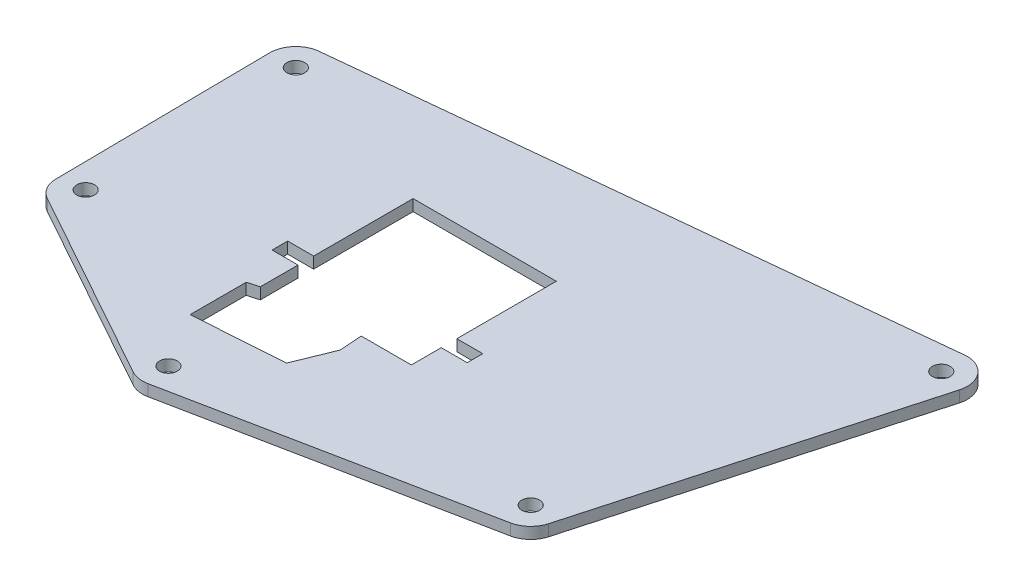
ISO-10303-21;
HEADER;
FILE_DESCRIPTION(('STEP AP214'),'2;1');
FILE_NAME('part.step','',(''),(''),'','','');
FILE_SCHEMA(('AUTOMOTIVE_DESIGN { 1 0 10303 214 1 1 1 1 }'));
ENDSEC;
DATA;
#1=APPLICATION_CONTEXT('core data for automotive mechanical design processes');
#2=APPLICATION_PROTOCOL_DEFINITION('international standard','automotive_design',2000,#1);
#3=PRODUCT_CONTEXT('',#1,'mechanical');
#4=PRODUCT('Part','Part','',(#3));
#5=PRODUCT_RELATED_PRODUCT_CATEGORY('part','',(#4));
#6=PRODUCT_DEFINITION_FORMATION('','',#4);
#7=PRODUCT_DEFINITION_CONTEXT('part definition',#1,'design');
#8=PRODUCT_DEFINITION('design','',#6,#7);
#9=PRODUCT_DEFINITION_SHAPE('','',#8);
#10=(LENGTH_UNIT() NAMED_UNIT(*) SI_UNIT(.MILLI.,.METRE.));
#11=(NAMED_UNIT(*) PLANE_ANGLE_UNIT() SI_UNIT($,.RADIAN.));
#12=(NAMED_UNIT(*) SI_UNIT($,.STERADIAN.) SOLID_ANGLE_UNIT());
#13=UNCERTAINTY_MEASURE_WITH_UNIT(LENGTH_MEASURE(1.E-05),#10,'distance_accuracy_value','');
#14=(GEOMETRIC_REPRESENTATION_CONTEXT(3) GLOBAL_UNCERTAINTY_ASSIGNED_CONTEXT((#13)) GLOBAL_UNIT_ASSIGNED_CONTEXT((#10,
#11,#12)) REPRESENTATION_CONTEXT('',''));
#15=CARTESIAN_POINT('',(0.,0.,0.));
#16=DIRECTION('',(0.,0.,1.));
#17=DIRECTION('',(1.,0.,0.));
#18=AXIS2_PLACEMENT_3D('',#15,#16,#17);
#19=CARTESIAN_POINT('',(-3.55000562107084,3.175,1.59698455984096));
#20=DIRECTION('',(0.,1.,0.));
#21=DIRECTION('',(0.,0.,1.));
#22=AXIS2_PLACEMENT_3D('',#19,#20,#21);
#23=PLANE('',#22);
#24=DIRECTION('',(1.,0.,0.));
#25=VECTOR('',#24,1.);
#26=CARTESIAN_POINT('',(64.3282972748801,3.175,-3.0580507004931));
#27=LINE('',#26,#25);
#28=CARTESIAN_POINT('',(70.322516982362,3.175,-3.0580507004931));
#29=VERTEX_POINT('',#28);
#30=CARTESIAN_POINT('',(84.3282972748801,3.175,-3.0580507004931));
#31=VERTEX_POINT('',#30);
#32=EDGE_CURVE('E314',#29,#31,#27,.T.);
#33=ORIENTED_EDGE('',*,*,#32,.F.);
#34=DIRECTION('',(-0.0709947819865391,0.,-0.997476686910869));
#35=VECTOR('',#34,1.);
#36=CARTESIAN_POINT('',(70.7748098328332,3.175,3.29666384862661));
#37=LINE('',#36,#35);
#38=CARTESIAN_POINT('',(70.7748098328332,3.175,3.29666384862661));
#39=VERTEX_POINT('',#38);
#40=EDGE_CURVE('E396',#39,#29,#37,.T.);
#41=ORIENTED_EDGE('',*,*,#40,.F.);
#42=DIRECTION('',(0.376798129201933,0.,-0.926295400954751));
#43=VECTOR('',#42,1.);
#44=CARTESIAN_POINT('',(66.4681046224158,3.175,13.8839808242359));
#45=LINE('',#44,#43);
#46=CARTESIAN_POINT('',(66.4681046224158,3.175,13.8839808242359));
#47=VERTEX_POINT('',#46);
#48=EDGE_CURVE('E392',#47,#39,#45,.T.);
#49=ORIENTED_EDGE('',*,*,#48,.F.);
#50=DIRECTION('',(0.997476686910869,0.,-0.0709947819865385));
#51=VECTOR('',#50,1.);
#52=CARTESIAN_POINT('',(41.2559345364309,3.175,15.6784413285765));
#53=LINE('',#52,#51);
#54=CARTESIAN_POINT('',(41.2559345364309,3.175,15.6784413285765));
#55=VERTEX_POINT('',#54);
#56=EDGE_CURVE('E388',#55,#47,#53,.T.);
#57=ORIENTED_EDGE('',*,*,#56,.F.);
#58=DIRECTION('',(0.,0.,1.));
#59=VECTOR('',#58,1.);
#60=CARTESIAN_POINT('',(41.2559345364309,3.175,0.));
#61=LINE('',#60,#59);
#62=CARTESIAN_POINT('',(41.2559345364309,3.175,0.));
#63=VERTEX_POINT('',#62);
#64=EDGE_CURVE('E71',#63,#55,#61,.T.);
#65=ORIENTED_EDGE('',*,*,#64,.F.);
#66=DIRECTION('',(-0.961898419475829,0.,0.27340707856583));
#67=VECTOR('',#66,1.);
#68=CARTESIAN_POINT('',(53.8620195794234,3.175,-3.58311523750619));
#69=LINE('',#68,#67);
#70=CARTESIAN_POINT('',(44.3282972748801,3.175,-0.873279031970586));
#71=VERTEX_POINT('',#70);
#72=EDGE_CURVE('E371',#71,#63,#69,.T.);
#73=ORIENTED_EDGE('',*,*,#72,.F.);
#74=DIRECTION('',(0.,0.,1.));
#75=VECTOR('',#74,1.);
#76=CARTESIAN_POINT('',(44.3282972748801,3.175,-3.05805070049311));
#77=LINE('',#76,#75);
#78=CARTESIAN_POINT('',(44.3282972748801,3.175,-11.4097519480117));
#79=VERTEX_POINT('',#78);
#80=EDGE_CURVE('E311',#79,#71,#77,.T.);
#81=ORIENTED_EDGE('',*,*,#80,.F.);
#82=DIRECTION('',(1.,0.,0.));
#83=VECTOR('',#82,1.);
#84=CARTESIAN_POINT('',(37.0782972748801,3.175,-11.4097519480117));
#85=LINE('',#84,#83);
#86=CARTESIAN_POINT('',(37.0782972748801,3.175,-11.4097519480117));
#87=VERTEX_POINT('',#86);
#88=EDGE_CURVE('E307',#87,#79,#85,.T.);
#89=ORIENTED_EDGE('',*,*,#88,.F.);
#90=DIRECTION('',(0.,0.,1.));
#91=VECTOR('',#90,1.);
#92=CARTESIAN_POINT('',(37.0782972748801,3.175,-15.7580507004931));
#93=LINE('',#92,#91);
#94=CARTESIAN_POINT('',(37.0782972748801,3.175,-15.7580507004931));
#95=VERTEX_POINT('',#94);
#96=EDGE_CURVE('E303',#95,#87,#93,.T.);
#97=ORIENTED_EDGE('',*,*,#96,.F.);
#98=DIRECTION('',(-1.,0.,0.));
#99=VECTOR('',#98,1.);
#100=CARTESIAN_POINT('',(37.0782972748801,3.175,-15.7580507004931));
#101=LINE('',#100,#99);
#102=CARTESIAN_POINT('',(44.3282972748801,3.175,-15.7580507004931));
#103=VERTEX_POINT('',#102);
#104=EDGE_CURVE('E300',#103,#95,#101,.T.);
#105=ORIENTED_EDGE('',*,*,#104,.F.);
#106=DIRECTION('',(0.,0.,1.));
#107=VECTOR('',#106,1.);
#108=CARTESIAN_POINT('',(44.3282972748801,3.175,-43.5580507004931));
#109=LINE('',#108,#107);
#110=CARTESIAN_POINT('',(44.3282972748801,3.175,-43.5580507004931));
#111=VERTEX_POINT('',#110);
#112=EDGE_CURVE('E235',#111,#103,#109,.T.);
#113=ORIENTED_EDGE('',*,*,#112,.F.);
#114=DIRECTION('',(-1.,0.,0.));
#115=VECTOR('',#114,1.);
#116=CARTESIAN_POINT('',(44.3282972748801,3.175,-43.5580507004931));
#117=LINE('',#116,#115);
#118=CARTESIAN_POINT('',(84.3282972748801,3.175,-43.5580507004931));
#119=VERTEX_POINT('',#118);
#120=EDGE_CURVE('E258',#119,#111,#117,.T.);
#121=ORIENTED_EDGE('',*,*,#120,.F.);
#122=DIRECTION('',(0.,0.,-1.));
#123=VECTOR('',#122,1.);
#124=CARTESIAN_POINT('',(84.3282972748801,3.175,-43.5580507004931));
#125=LINE('',#124,#123);
#126=CARTESIAN_POINT('',(84.3282972748801,3.175,-15.7580507004931));
#127=VERTEX_POINT('',#126);
#128=EDGE_CURVE('E262',#127,#119,#125,.T.);
#129=ORIENTED_EDGE('',*,*,#128,.F.);
#130=DIRECTION('',(-1.,0.,0.));
#131=VECTOR('',#130,1.);
#132=CARTESIAN_POINT('',(84.3282972748801,3.175,-15.7580507004931));
#133=LINE('',#132,#131);
#134=CARTESIAN_POINT('',(91.5782972748801,3.175,-15.7580507004931));
#135=VERTEX_POINT('',#134);
#136=EDGE_CURVE('E329',#135,#127,#133,.T.);
#137=ORIENTED_EDGE('',*,*,#136,.F.);
#138=DIRECTION('',(0.,0.,-1.));
#139=VECTOR('',#138,1.);
#140=CARTESIAN_POINT('',(91.5782972748801,3.175,-15.7580507004931));
#141=LINE('',#140,#139);
#142=CARTESIAN_POINT('',(91.5782972748801,3.175,-11.4097519480117));
#143=VERTEX_POINT('',#142);
#144=EDGE_CURVE('E325',#143,#135,#141,.T.);
#145=ORIENTED_EDGE('',*,*,#144,.F.);
#146=DIRECTION('',(1.,0.,0.));
#147=VECTOR('',#146,1.);
#148=CARTESIAN_POINT('',(84.3282972748801,3.175,-11.4097519480117));
#149=LINE('',#148,#147);
#150=CARTESIAN_POINT('',(84.3282972748801,3.175,-11.4097519480117));
#151=VERTEX_POINT('',#150);
#152=EDGE_CURVE('E321',#151,#143,#149,.T.);
#153=ORIENTED_EDGE('',*,*,#152,.F.);
#154=DIRECTION('',(0.,0.,-1.));
#155=VECTOR('',#154,1.);
#156=CARTESIAN_POINT('',(84.3282972748801,3.175,-11.4097519480117));
#157=LINE('',#156,#155);
#158=EDGE_CURVE('E317',#31,#151,#157,.T.);
#159=ORIENTED_EDGE('',*,*,#158,.F.);
#160=EDGE_LOOP('',(#33,#41,#49,#57,#65,#73,#81,#89,#97,#105,#113,#121,#129,#137,#145,#153,#159));
#161=FACE_BOUND('',#160,.T.);
#162=CARTESIAN_POINT('',(-3.71964814280204,3.175,-58.83082926478));
#163=DIRECTION('',(0.,1.,0.));
#164=DIRECTION('',(0.,0.,1.));
#165=AXIS2_PLACEMENT_3D('',#162,#163,#164);
#166=CIRCLE('',#165,2.4892);
#167=CARTESIAN_POINT('',(-3.71964814280204,3.175,-56.34162926478));
#168=VERTEX_POINT('',#167);
#169=EDGE_CURVE('E422',#168,#168,#166,.T.);
#170=ORIENTED_EDGE('',*,*,#169,.F.);
#171=EDGE_LOOP('',(#170));
#172=FACE_BOUND('',#171,.T.);
#173=CARTESIAN_POINT('',(50.6688213969302,3.175,31.1332223314106));
#174=DIRECTION('',(0.,1.,0.));
#175=DIRECTION('',(0.,0.,1.));
#176=AXIS2_PLACEMENT_3D('',#173,#174,#175);
#177=CIRCLE('',#176,2.4892);
#178=CARTESIAN_POINT('',(50.6688213969302,3.175,33.6224223314105));
#179=VERTEX_POINT('',#178);
#180=EDGE_CURVE('E438',#179,#179,#177,.T.);
#181=ORIENTED_EDGE('',*,*,#180,.F.);
#182=EDGE_LOOP('',(#181));
#183=FACE_BOUND('',#182,.T.);
#184=CARTESIAN_POINT('',(-3.55000562107084,3.175,1.59698455984096));
#185=DIRECTION('',(0.,1.,0.));
#186=DIRECTION('',(0.,0.,1.));
#187=AXIS2_PLACEMENT_3D('',#184,#185,#186);
#188=CIRCLE('',#187,6.73934713952884);
#189=CARTESIAN_POINT('',(-10.2889241238706,3.175,1.67299297844045));
#190=VERTEX_POINT('',#189);
#191=CARTESIAN_POINT('',(-6.82298680015305,3.175,7.48819785325084));
#192=VERTEX_POINT('',#191);
#193=EDGE_CURVE('E454',#190,#192,#188,.T.);
#194=ORIENTED_EDGE('',*,*,#193,.T.);
#195=DIRECTION('',(0.874151927692767,0.,0.485652558225547));
#196=VECTOR('',#195,1.);
#197=CARTESIAN_POINT('',(-6.82298680015305,3.175,7.48819785325084));
#198=LINE('',#197,#196);
#199=CARTESIAN_POINT('',(47.147014740446,3.175,37.4723098654602));
#200=VERTEX_POINT('',#199);
#201=EDGE_CURVE('E458',#192,#200,#198,.T.);
#202=ORIENTED_EDGE('',*,*,#201,.T.);
#203=CARTESIAN_POINT('',(50.6688213969302,3.175,31.1332223314106));
#204=DIRECTION('',(0.,1.,0.));
#205=DIRECTION('',(0.,0.,1.));
#206=AXIS2_PLACEMENT_3D('',#203,#204,#205);
#207=CIRCLE('',#206,7.2517);
#208=CARTESIAN_POINT('',(52.0976679162457,3.175,38.2427617338079));
#209=VERTEX_POINT('',#208);
#210=EDGE_CURVE('E462',#200,#209,#207,.T.);
#211=ORIENTED_EDGE('',*,*,#210,.T.);
#212=DIRECTION('',(0.980396238454062,0.,-0.197036076963399));
#213=VECTOR('',#212,1.);
#214=CARTESIAN_POINT('',(52.0976679162457,3.175,38.2427617338079));
#215=LINE('',#214,#213);
#216=CARTESIAN_POINT('',(136.359344262205,3.175,21.3081902877289));
#217=VERTEX_POINT('',#216);
#218=EDGE_CURVE('E465',#209,#217,#215,.T.);
#219=ORIENTED_EDGE('',*,*,#218,.T.);
#220=CARTESIAN_POINT('',(134.930497742889,3.175,14.1986508853315));
#221=DIRECTION('',(0.,1.,0.));
#222=DIRECTION('',(0.,0.,1.));
#223=AXIS2_PLACEMENT_3D('',#220,#221,#222);
#224=CIRCLE('',#223,7.25170000000002);
#225=CARTESIAN_POINT('',(141.916296900979,3.175,16.1443546173629));
#226=VERTEX_POINT('',#225);
#227=EDGE_CURVE('E468',#217,#226,#224,.T.);
#228=ORIENTED_EDGE('',*,*,#227,.T.);
#229=DIRECTION('',(0.268310014483694,0.,-0.96333261967389));
#230=VECTOR('',#229,1.);
#231=CARTESIAN_POINT('',(141.916296900979,3.175,16.1443546173629));
#232=LINE('',#231,#230);
#233=CARTESIAN_POINT('',(166.903433989707,3.175,-73.5687493685413));
#234=VERTEX_POINT('',#233);
#235=EDGE_CURVE('E471',#226,#234,#232,.T.);
#236=ORIENTED_EDGE('',*,*,#235,.T.);
#237=CARTESIAN_POINT('',(159.917634831618,3.175,-75.5144531005728));
#238=DIRECTION('',(0.,1.,0.));
#239=DIRECTION('',(0.,0.,1.));
#240=AXIS2_PLACEMENT_3D('',#237,#238,#239);
#241=CIRCLE('',#240,7.2517);
#242=CARTESIAN_POINT('',(159.182077211553,3.175,-82.728751949218));
#243=VERTEX_POINT('',#242);
#244=EDGE_CURVE('E474',#234,#243,#241,.T.);
#245=ORIENTED_EDGE('',*,*,#244,.T.);
#246=DIRECTION('',(-0.994842429864068,0.,0.101432439299058));
#247=VECTOR('',#246,1.);
#248=CARTESIAN_POINT('',(-4.36614572243492,3.175,-66.0536537655919));
#249=LINE('',#248,#247);
#250=CARTESIAN_POINT('',(-4.36614572243492,3.175,-66.0536537655919));
#251=VERTEX_POINT('',#250);
#252=EDGE_CURVE('E477',#243,#251,#249,.T.);
#253=ORIENTED_EDGE('',*,*,#252,.T.);
#254=CARTESIAN_POINT('',(-3.71964814280204,3.175,-58.83082926478));
#255=DIRECTION('',(0.,1.,0.));
#256=DIRECTION('',(0.,0.,1.));
#257=AXIS2_PLACEMENT_3D('',#254,#255,#256);
#258=CIRCLE('',#257,7.2517);
#259=CARTESIAN_POINT('',(-10.9695033076541,3.175,-58.6672658866423));
#260=VERTEX_POINT('',#259);
#261=EDGE_CURVE('E480',#251,#260,#258,.T.);
#262=ORIENTED_EDGE('',*,*,#261,.T.);
#263=DIRECTION('',(0.0112783058990494,0.,0.999936397885409));
#264=VECTOR('',#263,1.);
#265=CARTESIAN_POINT('',(-10.9695033076541,3.175,-58.6672658866423));
#266=LINE('',#265,#264);
#267=EDGE_CURVE('E483',#260,#190,#266,.T.);
#268=ORIENTED_EDGE('',*,*,#267,.T.);
#269=EDGE_LOOP('',(#194,#202,#211,#219,#228,#236,#245,#253,#262,#268));
#270=FACE_BOUND('',#269,.T.);
#271=CARTESIAN_POINT('',(159.917634831618,3.175,-75.5144531005728));
#272=DIRECTION('',(0.,1.,0.));
#273=DIRECTION('',(0.,0.,1.));
#274=AXIS2_PLACEMENT_3D('',#271,#272,#273);
#275=CIRCLE('',#274,2.48919999999963);
#276=CARTESIAN_POINT('',(159.917634831618,3.175,-73.0252531005731));
#277=VERTEX_POINT('',#276);
#278=EDGE_CURVE('E446',#277,#277,#275,.T.);
#279=ORIENTED_EDGE('',*,*,#278,.F.);
#280=EDGE_LOOP('',(#279));
#281=FACE_BOUND('',#280,.T.);
#282=CARTESIAN_POINT('',(134.930497742889,3.175,14.1986508853315));
#283=DIRECTION('',(0.,1.,0.));
#284=DIRECTION('',(0.,0.,1.));
#285=AXIS2_PLACEMENT_3D('',#282,#283,#284);
#286=CIRCLE('',#285,2.4892);
#287=CARTESIAN_POINT('',(134.930497742889,3.175,16.6878508853315));
#288=VERTEX_POINT('',#287);
#289=EDGE_CURVE('E430',#288,#288,#286,.T.);
#290=ORIENTED_EDGE('',*,*,#289,.F.);
#291=EDGE_LOOP('',(#290));
#292=FACE_BOUND('',#291,.T.);
#293=CARTESIAN_POINT('',(-3.50812631941597,3.175,0.0860171733952156));
#294=DIRECTION('',(0.,1.,0.));
#295=DIRECTION('',(0.,0.,1.));
#296=AXIS2_PLACEMENT_3D('',#293,#294,#295);
#297=CIRCLE('',#296,2.4892);
#298=CARTESIAN_POINT('',(-3.50812631941597,3.175,2.57521717339521));
#299=VERTEX_POINT('',#298);
#300=EDGE_CURVE('E414',#299,#299,#297,.T.);
#301=ORIENTED_EDGE('',*,*,#300,.F.);
#302=EDGE_LOOP('',(#301));
#303=FACE_BOUND('',#302,.T.);
#304=ADVANCED_FACE('F47',(#161,#172,#183,#270,#281,#292,#303),#23,.T.);
#305=CARTESIAN_POINT('',(-3.55000562107084,0.,1.59698455984096));
#306=DIRECTION('',(0.,1.,0.));
#307=DIRECTION('',(0.,0.,1.));
#308=AXIS2_PLACEMENT_3D('',#305,#306,#307);
#309=PLANE('',#308);
#310=DIRECTION('',(-0.0709947819865391,0.,-0.997476686910869));
#311=VECTOR('',#310,1.);
#312=CARTESIAN_POINT('',(70.7748098328332,0.,3.29666384862661));
#313=LINE('',#312,#311);
#314=CARTESIAN_POINT('',(70.7748098328332,0.,3.29666384862661));
#315=VERTEX_POINT('',#314);
#316=CARTESIAN_POINT('',(70.322516982362,0.,-3.0580507004931));
#317=VERTEX_POINT('',#316);
#318=EDGE_CURVE('E379',#315,#317,#313,.T.);
#319=ORIENTED_EDGE('',*,*,#318,.T.);
#320=DIRECTION('',(1.,0.,0.));
#321=VECTOR('',#320,1.);
#322=CARTESIAN_POINT('',(64.3282972748801,0.,-3.0580507004931));
#323=LINE('',#322,#321);
#324=CARTESIAN_POINT('',(84.3282972748801,0.,-3.0580507004931));
#325=VERTEX_POINT('',#324);
#326=EDGE_CURVE('E63',#317,#325,#323,.T.);
#327=ORIENTED_EDGE('',*,*,#326,.T.);
#328=DIRECTION('',(0.,0.,-1.));
#329=VECTOR('',#328,1.);
#330=CARTESIAN_POINT('',(84.3282972748801,0.,-11.4097519480117));
#331=LINE('',#330,#329);
#332=CARTESIAN_POINT('',(84.3282972748801,0.,-11.4097519480117));
#333=VERTEX_POINT('',#332);
#334=EDGE_CURVE('E277',#325,#333,#331,.T.);
#335=ORIENTED_EDGE('',*,*,#334,.T.);
#336=DIRECTION('',(1.,0.,0.));
#337=VECTOR('',#336,1.);
#338=CARTESIAN_POINT('',(84.3282972748801,0.,-11.4097519480117));
#339=LINE('',#338,#337);
#340=CARTESIAN_POINT('',(91.5782972748801,0.,-11.4097519480117));
#341=VERTEX_POINT('',#340);
#342=EDGE_CURVE('E281',#333,#341,#339,.T.);
#343=ORIENTED_EDGE('',*,*,#342,.T.);
#344=DIRECTION('',(0.,0.,-1.));
#345=VECTOR('',#344,1.);
#346=CARTESIAN_POINT('',(91.5782972748801,0.,-15.7580507004931));
#347=LINE('',#346,#345);
#348=CARTESIAN_POINT('',(91.5782972748801,0.,-15.7580507004931));
#349=VERTEX_POINT('',#348);
#350=EDGE_CURVE('E285',#341,#349,#347,.T.);
#351=ORIENTED_EDGE('',*,*,#350,.T.);
#352=DIRECTION('',(-1.,0.,0.));
#353=VECTOR('',#352,1.);
#354=CARTESIAN_POINT('',(84.3282972748801,0.,-15.7580507004931));
#355=LINE('',#354,#353);
#356=CARTESIAN_POINT('',(84.3282972748801,0.,-15.7580507004931));
#357=VERTEX_POINT('',#356);
#358=EDGE_CURVE('E289',#349,#357,#355,.T.);
#359=ORIENTED_EDGE('',*,*,#358,.T.);
#360=DIRECTION('',(0.,0.,-1.));
#361=VECTOR('',#360,1.);
#362=CARTESIAN_POINT('',(84.3282972748801,0.,-43.5580507004931));
#363=LINE('',#362,#361);
#364=CARTESIAN_POINT('',(84.3282972748801,0.,-43.5580507004931));
#365=VERTEX_POINT('',#364);
#366=EDGE_CURVE('E293',#357,#365,#363,.T.);
#367=ORIENTED_EDGE('',*,*,#366,.T.);
#368=DIRECTION('',(-1.,0.,0.));
#369=VECTOR('',#368,1.);
#370=CARTESIAN_POINT('',(44.3282972748801,0.,-43.5580507004931));
#371=LINE('',#370,#369);
#372=CARTESIAN_POINT('',(44.3282972748801,0.,-43.5580507004931));
#373=VERTEX_POINT('',#372);
#374=EDGE_CURVE('E241',#365,#373,#371,.T.);
#375=ORIENTED_EDGE('',*,*,#374,.T.);
#376=DIRECTION('',(0.,0.,1.));
#377=VECTOR('',#376,1.);
#378=CARTESIAN_POINT('',(44.3282972748801,0.,-43.5580507004931));
#379=LINE('',#378,#377);
#380=CARTESIAN_POINT('',(44.3282972748801,0.,-15.7580507004931));
#381=VERTEX_POINT('',#380);
#382=EDGE_CURVE('E232',#373,#381,#379,.T.);
#383=ORIENTED_EDGE('',*,*,#382,.T.);
#384=DIRECTION('',(-1.,0.,0.));
#385=VECTOR('',#384,1.);
#386=CARTESIAN_POINT('',(37.0782972748801,0.,-15.7580507004931));
#387=LINE('',#386,#385);
#388=CARTESIAN_POINT('',(37.0782972748801,0.,-15.7580507004931));
#389=VERTEX_POINT('',#388);
#390=EDGE_CURVE('E244',#381,#389,#387,.T.);
#391=ORIENTED_EDGE('',*,*,#390,.T.);
#392=DIRECTION('',(0.,0.,1.));
#393=VECTOR('',#392,1.);
#394=CARTESIAN_POINT('',(37.0782972748801,0.,-15.7580507004931));
#395=LINE('',#394,#393);
#396=CARTESIAN_POINT('',(37.0782972748801,0.,-11.4097519480117));
#397=VERTEX_POINT('',#396);
#398=EDGE_CURVE('E250',#389,#397,#395,.T.);
#399=ORIENTED_EDGE('',*,*,#398,.T.);
#400=DIRECTION('',(1.,0.,0.));
#401=VECTOR('',#400,1.);
#402=CARTESIAN_POINT('',(37.0782972748801,0.,-11.4097519480117));
#403=LINE('',#402,#401);
#404=CARTESIAN_POINT('',(44.3282972748801,0.,-11.4097519480117));
#405=VERTEX_POINT('',#404);
#406=EDGE_CURVE('E267',#397,#405,#403,.T.);
#407=ORIENTED_EDGE('',*,*,#406,.T.);
#408=DIRECTION('',(0.,0.,1.));
#409=VECTOR('',#408,1.);
#410=CARTESIAN_POINT('',(44.3282972748801,0.,-11.4097519480117));
#411=LINE('',#410,#409);
#412=CARTESIAN_POINT('',(44.3282972748801,0.,-0.873279031970587));
#413=VERTEX_POINT('',#412);
#414=EDGE_CURVE('E271',#405,#413,#411,.T.);
#415=ORIENTED_EDGE('',*,*,#414,.T.);
#416=DIRECTION('',(-0.961898419475829,0.,0.27340707856583));
#417=VECTOR('',#416,1.);
#418=CARTESIAN_POINT('',(53.8620195794234,0.,-3.58311523750619));
#419=LINE('',#418,#417);
#420=CARTESIAN_POINT('',(41.2559345364309,0.,0.));
#421=VERTEX_POINT('',#420);
#422=EDGE_CURVE('E382',#413,#421,#419,.T.);
#423=ORIENTED_EDGE('',*,*,#422,.T.);
#424=DIRECTION('',(0.,0.,1.));
#425=VECTOR('',#424,1.);
#426=CARTESIAN_POINT('',(41.2559345364309,0.,0.));
#427=LINE('',#426,#425);
#428=CARTESIAN_POINT('',(41.2559345364309,0.,15.6784413285765));
#429=VERTEX_POINT('',#428);
#430=EDGE_CURVE('E366',#421,#429,#427,.T.);
#431=ORIENTED_EDGE('',*,*,#430,.T.);
#432=DIRECTION('',(0.997476686910869,0.,-0.0709947819865385));
#433=VECTOR('',#432,1.);
#434=CARTESIAN_POINT('',(41.2559345364309,0.,15.6784413285765));
#435=LINE('',#434,#433);
#436=CARTESIAN_POINT('',(66.4681046224158,0.,13.8839808242359));
#437=VERTEX_POINT('',#436);
#438=EDGE_CURVE('E370',#429,#437,#435,.T.);
#439=ORIENTED_EDGE('',*,*,#438,.T.);
#440=DIRECTION('',(0.376798129201933,0.,-0.926295400954751));
#441=VECTOR('',#440,1.);
#442=CARTESIAN_POINT('',(66.4681046224158,0.,13.8839808242359));
#443=LINE('',#442,#441);
#444=EDGE_CURVE('E375',#437,#315,#443,.T.);
#445=ORIENTED_EDGE('',*,*,#444,.T.);
#446=EDGE_LOOP('',(#319,#327,#335,#343,#351,#359,#367,#375,#383,#391,#399,#407,#415,#423,#431,
#439,#445));
#447=FACE_BOUND('',#446,.T.);
#448=CARTESIAN_POINT('',(-3.55000562107084,0.,1.59698455984096));
#449=DIRECTION('',(0.,1.,0.));
#450=DIRECTION('',(0.,0.,1.));
#451=AXIS2_PLACEMENT_3D('',#448,#449,#450);
#452=CIRCLE('',#451,6.73934713952884);
#453=CARTESIAN_POINT('',(-10.2889241238706,0.,1.67299297844045));
#454=VERTEX_POINT('',#453);
#455=CARTESIAN_POINT('',(-6.82298680015305,0.,7.48819785325084));
#456=VERTEX_POINT('',#455);
#457=EDGE_CURVE('E450',#454,#456,#452,.T.);
#458=ORIENTED_EDGE('',*,*,#457,.F.);
#459=DIRECTION('',(0.0112783058990494,0.,0.999936397885409));
#460=VECTOR('',#459,1.);
#461=CARTESIAN_POINT('',(-10.9695033076541,0.,-58.6672658866423));
#462=LINE('',#461,#460);
#463=CARTESIAN_POINT('',(-10.9695033076541,0.,-58.6672658866423));
#464=VERTEX_POINT('',#463);
#465=EDGE_CURVE('E459',#464,#454,#462,.T.);
#466=ORIENTED_EDGE('',*,*,#465,.F.);
#467=CARTESIAN_POINT('',(-3.71964814280204,0.,-58.83082926478));
#468=DIRECTION('',(0.,1.,0.));
#469=DIRECTION('',(0.,0.,1.));
#470=AXIS2_PLACEMENT_3D('',#467,#468,#469);
#471=CIRCLE('',#470,7.2517);
#472=CARTESIAN_POINT('',(-4.36614572243492,0.,-66.0536537655919));
#473=VERTEX_POINT('',#472);
#474=EDGE_CURVE('E511',#473,#464,#471,.T.);
#475=ORIENTED_EDGE('',*,*,#474,.F.);
#476=DIRECTION('',(-0.994842429864068,0.,0.101432439299058));
#477=VECTOR('',#476,1.);
#478=CARTESIAN_POINT('',(-4.36614572243492,0.,-66.0536537655919));
#479=LINE('',#478,#477);
#480=CARTESIAN_POINT('',(159.182077211553,0.,-82.728751949218));
#481=VERTEX_POINT('',#480);
#482=EDGE_CURVE('E508',#481,#473,#479,.T.);
#483=ORIENTED_EDGE('',*,*,#482,.F.);
#484=CARTESIAN_POINT('',(159.917634831618,0.,-75.5144531005728));
#485=DIRECTION('',(0.,1.,0.));
#486=DIRECTION('',(0.,0.,1.));
#487=AXIS2_PLACEMENT_3D('',#484,#485,#486);
#488=CIRCLE('',#487,7.2517);
#489=CARTESIAN_POINT('',(166.903433989707,0.,-73.5687493685413));
#490=VERTEX_POINT('',#489);
#491=EDGE_CURVE('E505',#490,#481,#488,.T.);
#492=ORIENTED_EDGE('',*,*,#491,.F.);
#493=DIRECTION('',(0.268310014483694,0.,-0.96333261967389));
#494=VECTOR('',#493,1.);
#495=CARTESIAN_POINT('',(141.916296900979,0.,16.1443546173629));
#496=LINE('',#495,#494);
#497=CARTESIAN_POINT('',(141.916296900979,0.,16.1443546173629));
#498=VERTEX_POINT('',#497);
#499=EDGE_CURVE('E502',#498,#490,#496,.T.);
#500=ORIENTED_EDGE('',*,*,#499,.F.);
#501=CARTESIAN_POINT('',(134.930497742889,0.,14.1986508853315));
#502=DIRECTION('',(0.,1.,0.));
#503=DIRECTION('',(0.,0.,1.));
#504=AXIS2_PLACEMENT_3D('',#501,#502,#503);
#505=CIRCLE('',#504,7.25170000000002);
#506=CARTESIAN_POINT('',(136.359344262205,0.,21.3081902877289));
#507=VERTEX_POINT('',#506);
#508=EDGE_CURVE('E499',#507,#498,#505,.T.);
#509=ORIENTED_EDGE('',*,*,#508,.F.);
#510=DIRECTION('',(0.980396238454062,0.,-0.197036076963399));
#511=VECTOR('',#510,1.);
#512=CARTESIAN_POINT('',(52.0976679162457,0.,38.2427617338079));
#513=LINE('',#512,#511);
#514=CARTESIAN_POINT('',(52.0976679162457,0.,38.2427617338079));
#515=VERTEX_POINT('',#514);
#516=EDGE_CURVE('E496',#515,#507,#513,.T.);
#517=ORIENTED_EDGE('',*,*,#516,.F.);
#518=CARTESIAN_POINT('',(50.6688213969302,0.,31.1332223314106));
#519=DIRECTION('',(0.,1.,0.));
#520=DIRECTION('',(0.,0.,1.));
#521=AXIS2_PLACEMENT_3D('',#518,#519,#520);
#522=CIRCLE('',#521,7.2517);
#523=CARTESIAN_POINT('',(47.147014740446,0.,37.4723098654602));
#524=VERTEX_POINT('',#523);
#525=EDGE_CURVE('E493',#524,#515,#522,.T.);
#526=ORIENTED_EDGE('',*,*,#525,.F.);
#527=DIRECTION('',(0.874151927692767,0.,0.485652558225547));
#528=VECTOR('',#527,1.);
#529=CARTESIAN_POINT('',(-6.82298680015305,0.,7.48819785325084));
#530=LINE('',#529,#528);
#531=EDGE_CURVE('E490',#456,#524,#530,.T.);
#532=ORIENTED_EDGE('',*,*,#531,.F.);
#533=EDGE_LOOP('',(#458,#466,#475,#483,#492,#500,#509,#517,#526,#532));
#534=FACE_BOUND('',#533,.T.);
#535=CARTESIAN_POINT('',(159.917634831618,0.,-75.5144531005728));
#536=DIRECTION('',(0.,1.,0.));
#537=DIRECTION('',(0.,0.,1.));
#538=AXIS2_PLACEMENT_3D('',#535,#536,#537);
#539=CIRCLE('',#538,2.48919999999963);
#540=CARTESIAN_POINT('',(159.917634831618,0.,-73.0252531005731));
#541=VERTEX_POINT('',#540);
#542=EDGE_CURVE('E442',#541,#541,#539,.T.);
#543=ORIENTED_EDGE('',*,*,#542,.T.);
#544=EDGE_LOOP('',(#543));
#545=FACE_BOUND('',#544,.T.);
#546=CARTESIAN_POINT('',(50.6688213969302,0.,31.1332223314106));
#547=DIRECTION('',(0.,1.,0.));
#548=DIRECTION('',(0.,0.,1.));
#549=AXIS2_PLACEMENT_3D('',#546,#547,#548);
#550=CIRCLE('',#549,2.4892);
#551=CARTESIAN_POINT('',(50.6688213969302,0.,33.6224223314105));
#552=VERTEX_POINT('',#551);
#553=EDGE_CURVE('E434',#552,#552,#550,.T.);
#554=ORIENTED_EDGE('',*,*,#553,.T.);
#555=EDGE_LOOP('',(#554));
#556=FACE_BOUND('',#555,.T.);
#557=CARTESIAN_POINT('',(134.930497742889,0.,14.1986508853315));
#558=DIRECTION('',(0.,1.,0.));
#559=DIRECTION('',(0.,0.,1.));
#560=AXIS2_PLACEMENT_3D('',#557,#558,#559);
#561=CIRCLE('',#560,2.4892);
#562=CARTESIAN_POINT('',(134.930497742889,0.,16.6878508853315));
#563=VERTEX_POINT('',#562);
#564=EDGE_CURVE('E426',#563,#563,#561,.T.);
#565=ORIENTED_EDGE('',*,*,#564,.T.);
#566=EDGE_LOOP('',(#565));
#567=FACE_BOUND('',#566,.T.);
#568=CARTESIAN_POINT('',(-3.71964814280204,0.,-58.83082926478));
#569=DIRECTION('',(0.,1.,0.));
#570=DIRECTION('',(0.,0.,1.));
#571=AXIS2_PLACEMENT_3D('',#568,#569,#570);
#572=CIRCLE('',#571,2.4892);
#573=CARTESIAN_POINT('',(-3.71964814280204,0.,-56.34162926478));
#574=VERTEX_POINT('',#573);
#575=EDGE_CURVE('E418',#574,#574,#572,.T.);
#576=ORIENTED_EDGE('',*,*,#575,.T.);
#577=EDGE_LOOP('',(#576));
#578=FACE_BOUND('',#577,.T.);
#579=CARTESIAN_POINT('',(-3.50812631941597,0.,0.0860171733952156));
#580=DIRECTION('',(0.,1.,0.));
#581=DIRECTION('',(0.,0.,1.));
#582=AXIS2_PLACEMENT_3D('',#579,#580,#581);
#583=CIRCLE('',#582,2.4892);
#584=CARTESIAN_POINT('',(-3.50812631941597,0.,2.57521717339521));
#585=VERTEX_POINT('',#584);
#586=EDGE_CURVE('E405',#585,#585,#583,.T.);
#587=ORIENTED_EDGE('',*,*,#586,.T.);
#588=EDGE_LOOP('',(#587));
#589=FACE_BOUND('',#588,.T.);
#590=ADVANCED_FACE('F253',(#447,#534,#545,#556,#567,#578,#589),#309,.F.);
#591=CARTESIAN_POINT('',(-3.55000562107084,3.175,1.59698455984096));
#592=DIRECTION('',(0.,-1.,0.));
#593=DIRECTION('',(0.,0.,-1.));
#594=AXIS2_PLACEMENT_3D('',#591,#592,#593);
#595=CYLINDRICAL_SURFACE('',#594,6.73934713952884);
#596=ORIENTED_EDGE('',*,*,#457,.T.);
#597=DIRECTION('',(0.,-1.,0.));
#598=VECTOR('',#597,1.);
#599=CARTESIAN_POINT('',(-6.82298680015305,3.175,7.48819785325084));
#600=LINE('',#599,#598);
#601=EDGE_CURVE('E551',#192,#456,#600,.T.);
#602=ORIENTED_EDGE('',*,*,#601,.F.);
#603=ORIENTED_EDGE('',*,*,#193,.F.);
#604=DIRECTION('',(0.,-1.,0.));
#605=VECTOR('',#604,1.);
#606=CARTESIAN_POINT('',(-10.2889241238706,3.175,1.67299297844045));
#607=LINE('',#606,#605);
#608=EDGE_CURVE('E486',#190,#454,#607,.T.);
#609=ORIENTED_EDGE('',*,*,#608,.T.);
#610=EDGE_LOOP('',(#596,#602,#603,#609));
#611=FACE_BOUND('',#610,.T.);
#612=ADVANCED_FACE('F49',(#611),#595,.T.);
#613=CARTESIAN_POINT('',(-6.82298680015305,3.175,7.48819785325084));
#614=DIRECTION('',(0.485652558225547,0.,-0.874151927692767));
#615=DIRECTION('',(-0.874151927692768,0.,-0.485652558225547));
#616=AXIS2_PLACEMENT_3D('',#613,#614,#615);
#617=PLANE('',#616);
#618=ORIENTED_EDGE('',*,*,#531,.T.);
#619=DIRECTION('',(0.,-1.,0.));
#620=VECTOR('',#619,1.);
#621=CARTESIAN_POINT('',(47.147014740446,3.175,37.4723098654602));
#622=LINE('',#621,#620);
#623=EDGE_CURVE('E547',#200,#524,#622,.T.);
#624=ORIENTED_EDGE('',*,*,#623,.F.);
#625=ORIENTED_EDGE('',*,*,#201,.F.);
#626=ORIENTED_EDGE('',*,*,#601,.T.);
#627=EDGE_LOOP('',(#618,#624,#625,#626));
#628=FACE_BOUND('',#627,.T.);
#629=ADVANCED_FACE('F666',(#628),#617,.F.);
#630=CARTESIAN_POINT('',(50.6688213969302,3.175,31.1332223314106));
#631=DIRECTION('',(0.,-1.,0.));
#632=DIRECTION('',(0.,0.,-1.));
#633=AXIS2_PLACEMENT_3D('',#630,#631,#632);
#634=CYLINDRICAL_SURFACE('',#633,7.2517);
#635=ORIENTED_EDGE('',*,*,#525,.T.);
#636=DIRECTION('',(0.,-1.,0.));
#637=VECTOR('',#636,1.);
#638=CARTESIAN_POINT('',(52.0976679162457,3.175,38.2427617338079));
#639=LINE('',#638,#637);
#640=EDGE_CURVE('E543',#209,#515,#639,.T.);
#641=ORIENTED_EDGE('',*,*,#640,.F.);
#642=ORIENTED_EDGE('',*,*,#210,.F.);
#643=ORIENTED_EDGE('',*,*,#623,.T.);
#644=EDGE_LOOP('',(#635,#641,#642,#643));
#645=FACE_BOUND('',#644,.T.);
#646=ADVANCED_FACE('F663',(#645),#634,.T.);
#647=CARTESIAN_POINT('',(52.0976679162457,3.175,38.2427617338079));
#648=DIRECTION('',(-0.197036076963399,0.,-0.980396238454062));
#649=DIRECTION('',(-0.980396238454062,0.,0.197036076963399));
#650=AXIS2_PLACEMENT_3D('',#647,#648,#649);
#651=PLANE('',#650);
#652=ORIENTED_EDGE('',*,*,#516,.T.);
#653=DIRECTION('',(0.,-1.,0.));
#654=VECTOR('',#653,1.);
#655=CARTESIAN_POINT('',(136.359344262205,3.175,21.3081902877289));
#656=LINE('',#655,#654);
#657=EDGE_CURVE('E539',#217,#507,#656,.T.);
#658=ORIENTED_EDGE('',*,*,#657,.F.);
#659=ORIENTED_EDGE('',*,*,#218,.F.);
#660=ORIENTED_EDGE('',*,*,#640,.T.);
#661=EDGE_LOOP('',(#652,#658,#659,#660));
#662=FACE_BOUND('',#661,.T.);
#663=ADVANCED_FACE('F659',(#662),#651,.F.);
#664=CARTESIAN_POINT('',(134.930497742889,3.175,14.1986508853315));
#665=DIRECTION('',(0.,-1.,0.));
#666=DIRECTION('',(0.,0.,-1.));
#667=AXIS2_PLACEMENT_3D('',#664,#665,#666);
#668=CYLINDRICAL_SURFACE('',#667,7.25170000000002);
#669=ORIENTED_EDGE('',*,*,#508,.T.);
#670=DIRECTION('',(0.,-1.,0.));
#671=VECTOR('',#670,1.);
#672=CARTESIAN_POINT('',(141.916296900979,3.175,16.1443546173629));
#673=LINE('',#672,#671);
#674=EDGE_CURVE('E535',#226,#498,#673,.T.);
#675=ORIENTED_EDGE('',*,*,#674,.F.);
#676=ORIENTED_EDGE('',*,*,#227,.F.);
#677=ORIENTED_EDGE('',*,*,#657,.T.);
#678=EDGE_LOOP('',(#669,#675,#676,#677));
#679=FACE_BOUND('',#678,.T.);
#680=ADVANCED_FACE('F655',(#679),#668,.T.);
#681=CARTESIAN_POINT('',(141.916296900979,3.175,16.1443546173629));
#682=DIRECTION('',(-0.96333261967389,0.,-0.268310014483694));
#683=DIRECTION('',(-0.268310014483695,0.,0.96333261967389));
#684=AXIS2_PLACEMENT_3D('',#681,#682,#683);
#685=PLANE('',#684);
#686=ORIENTED_EDGE('',*,*,#499,.T.);
#687=DIRECTION('',(0.,-1.,0.));
#688=VECTOR('',#687,1.);
#689=CARTESIAN_POINT('',(166.903433989707,3.175,-73.5687493685413));
#690=LINE('',#689,#688);
#691=EDGE_CURVE('E531',#234,#490,#690,.T.);
#692=ORIENTED_EDGE('',*,*,#691,.F.);
#693=ORIENTED_EDGE('',*,*,#235,.F.);
#694=ORIENTED_EDGE('',*,*,#674,.T.);
#695=EDGE_LOOP('',(#686,#692,#693,#694));
#696=FACE_BOUND('',#695,.T.);
#697=ADVANCED_FACE('F651',(#696),#685,.F.);
#698=CARTESIAN_POINT('',(159.917634831618,3.175,-75.5144531005728));
#699=DIRECTION('',(0.,-1.,0.));
#700=DIRECTION('',(0.,0.,-1.));
#701=AXIS2_PLACEMENT_3D('',#698,#699,#700);
#702=CYLINDRICAL_SURFACE('',#701,7.2517);
#703=ORIENTED_EDGE('',*,*,#491,.T.);
#704=DIRECTION('',(0.,-1.,0.));
#705=VECTOR('',#704,1.);
#706=CARTESIAN_POINT('',(159.182077211553,3.175,-82.728751949218));
#707=LINE('',#706,#705);
#708=EDGE_CURVE('E527',#243,#481,#707,.T.);
#709=ORIENTED_EDGE('',*,*,#708,.F.);
#710=ORIENTED_EDGE('',*,*,#244,.F.);
#711=ORIENTED_EDGE('',*,*,#691,.T.);
#712=EDGE_LOOP('',(#703,#709,#710,#711));
#713=FACE_BOUND('',#712,.T.);
#714=ADVANCED_FACE('F647',(#713),#702,.T.);
#715=CARTESIAN_POINT('',(-4.36614572243492,3.175,-66.0536537655919));
#716=DIRECTION('',(0.101432439299058,0.,0.994842429864068));
#717=DIRECTION('',(0.994842429864068,0.,-0.101432439299058));
#718=AXIS2_PLACEMENT_3D('',#715,#716,#717);
#719=PLANE('',#718);
#720=ORIENTED_EDGE('',*,*,#482,.T.);
#721=DIRECTION('',(0.,-1.,0.));
#722=VECTOR('',#721,1.);
#723=CARTESIAN_POINT('',(-4.36614572243492,3.175,-66.0536537655919));
#724=LINE('',#723,#722);
#725=EDGE_CURVE('E523',#251,#473,#724,.T.);
#726=ORIENTED_EDGE('',*,*,#725,.F.);
#727=ORIENTED_EDGE('',*,*,#252,.F.);
#728=ORIENTED_EDGE('',*,*,#708,.T.);
#729=EDGE_LOOP('',(#720,#726,#727,#728));
#730=FACE_BOUND('',#729,.T.);
#731=ADVANCED_FACE('F643',(#730),#719,.F.);
#732=CARTESIAN_POINT('',(-3.71964814280204,3.175,-58.83082926478));
#733=DIRECTION('',(0.,-1.,0.));
#734=DIRECTION('',(0.,0.,-1.));
#735=AXIS2_PLACEMENT_3D('',#732,#733,#734);
#736=CYLINDRICAL_SURFACE('',#735,7.2517);
#737=ORIENTED_EDGE('',*,*,#474,.T.);
#738=DIRECTION('',(0.,-1.,0.));
#739=VECTOR('',#738,1.);
#740=CARTESIAN_POINT('',(-10.9695033076541,3.175,-58.6672658866423));
#741=LINE('',#740,#739);
#742=EDGE_CURVE('E519',#260,#464,#741,.T.);
#743=ORIENTED_EDGE('',*,*,#742,.F.);
#744=ORIENTED_EDGE('',*,*,#261,.F.);
#745=ORIENTED_EDGE('',*,*,#725,.T.);
#746=EDGE_LOOP('',(#737,#743,#744,#745));
#747=FACE_BOUND('',#746,.T.);
#748=ADVANCED_FACE('F639',(#747),#736,.T.);
#749=CARTESIAN_POINT('',(-10.9695033076541,3.175,-58.6672658866423));
#750=DIRECTION('',(0.999936397885409,0.,-0.0112783058990494));
#751=DIRECTION('',(-0.0112783058990494,0.,-0.999936397885409));
#752=AXIS2_PLACEMENT_3D('',#749,#750,#751);
#753=PLANE('',#752);
#754=ORIENTED_EDGE('',*,*,#465,.T.);
#755=ORIENTED_EDGE('',*,*,#608,.F.);
#756=ORIENTED_EDGE('',*,*,#267,.F.);
#757=ORIENTED_EDGE('',*,*,#742,.T.);
#758=EDGE_LOOP('',(#754,#755,#756,#757));
#759=FACE_BOUND('',#758,.T.);
#760=ADVANCED_FACE('F636',(#759),#753,.F.);
#761=CARTESIAN_POINT('',(159.917634831618,3.175,-75.5144531005728));
#762=DIRECTION('',(0.,-1.,0.));
#763=DIRECTION('',(0.,0.,-1.));
#764=AXIS2_PLACEMENT_3D('',#761,#762,#763);
#765=CYLINDRICAL_SURFACE('',#764,2.48919999999963);
#766=ORIENTED_EDGE('',*,*,#278,.T.);
#767=EDGE_LOOP('',(#766));
#768=FACE_BOUND('',#767,.T.);
#769=ORIENTED_EDGE('',*,*,#542,.F.);
#770=EDGE_LOOP('',(#769));
#771=FACE_BOUND('',#770,.T.);
#772=ADVANCED_FACE('F633',(#768,#771),#765,.F.);
#773=CARTESIAN_POINT('',(50.6688213969302,3.175,31.1332223314106));
#774=DIRECTION('',(0.,-1.,0.));
#775=DIRECTION('',(0.,0.,-1.));
#776=AXIS2_PLACEMENT_3D('',#773,#774,#775);
#777=CYLINDRICAL_SURFACE('',#776,2.4892);
#778=ORIENTED_EDGE('',*,*,#180,.T.);
#779=EDGE_LOOP('',(#778));
#780=FACE_BOUND('',#779,.T.);
#781=ORIENTED_EDGE('',*,*,#553,.F.);
#782=EDGE_LOOP('',(#781));
#783=FACE_BOUND('',#782,.T.);
#784=ADVANCED_FACE('F717',(#780,#783),#777,.F.);
#785=CARTESIAN_POINT('',(134.930497742889,3.175,14.1986508853315));
#786=DIRECTION('',(0.,-1.,0.));
#787=DIRECTION('',(0.,0.,-1.));
#788=AXIS2_PLACEMENT_3D('',#785,#786,#787);
#789=CYLINDRICAL_SURFACE('',#788,2.4892);
#790=ORIENTED_EDGE('',*,*,#289,.T.);
#791=EDGE_LOOP('',(#790));
#792=FACE_BOUND('',#791,.T.);
#793=ORIENTED_EDGE('',*,*,#564,.F.);
#794=EDGE_LOOP('',(#793));
#795=FACE_BOUND('',#794,.T.);
#796=ADVANCED_FACE('F714',(#792,#795),#789,.F.);
#797=CARTESIAN_POINT('',(-3.71964814280204,3.175,-58.83082926478));
#798=DIRECTION('',(0.,-1.,0.));
#799=DIRECTION('',(0.,0.,-1.));
#800=AXIS2_PLACEMENT_3D('',#797,#798,#799);
#801=CYLINDRICAL_SURFACE('',#800,2.4892);
#802=ORIENTED_EDGE('',*,*,#169,.T.);
#803=EDGE_LOOP('',(#802));
#804=FACE_BOUND('',#803,.T.);
#805=ORIENTED_EDGE('',*,*,#575,.F.);
#806=EDGE_LOOP('',(#805));
#807=FACE_BOUND('',#806,.T.);
#808=ADVANCED_FACE('F621',(#804,#807),#801,.F.);
#809=CARTESIAN_POINT('',(-3.50812631941597,3.175,0.0860171733952156));
#810=DIRECTION('',(0.,-1.,0.));
#811=DIRECTION('',(0.,0.,-1.));
#812=AXIS2_PLACEMENT_3D('',#809,#810,#811);
#813=CYLINDRICAL_SURFACE('',#812,2.4892);
#814=ORIENTED_EDGE('',*,*,#300,.T.);
#815=EDGE_LOOP('',(#814));
#816=FACE_BOUND('',#815,.T.);
#817=ORIENTED_EDGE('',*,*,#586,.F.);
#818=EDGE_LOOP('',(#817));
#819=FACE_BOUND('',#818,.T.);
#820=ADVANCED_FACE('F613',(#816,#819),#813,.F.);
#821=CARTESIAN_POINT('',(41.2559345364309,0.,0.));
#822=DIRECTION('',(-1.,0.,0.));
#823=DIRECTION('',(0.,0.,1.));
#824=AXIS2_PLACEMENT_3D('',#821,#822,#823);
#825=PLANE('',#824);
#826=ORIENTED_EDGE('',*,*,#64,.T.);
#827=DIRECTION('',(0.,1.,0.));
#828=VECTOR('',#827,1.);
#829=CARTESIAN_POINT('',(41.2559345364309,0.,15.6784413285765));
#830=LINE('',#829,#828);
#831=EDGE_CURVE('E385',#429,#55,#830,.T.);
#832=ORIENTED_EDGE('',*,*,#831,.F.);
#833=ORIENTED_EDGE('',*,*,#430,.F.);
#834=DIRECTION('',(0.,1.,0.));
#835=VECTOR('',#834,1.);
#836=CARTESIAN_POINT('',(41.2559345364309,0.,0.));
#837=LINE('',#836,#835);
#838=EDGE_CURVE('E402',#421,#63,#837,.T.);
#839=ORIENTED_EDGE('',*,*,#838,.T.);
#840=EDGE_LOOP('',(#826,#832,#833,#839));
#841=FACE_BOUND('',#840,.T.);
#842=ADVANCED_FACE('F611',(#841),#825,.F.);
#843=CARTESIAN_POINT('',(53.8620195794234,0.,-3.58311523750619));
#844=DIRECTION('',(-0.27340707856583,0.,-0.961898419475829));
#845=DIRECTION('',(-0.961898419475829,0.,0.27340707856583));
#846=AXIS2_PLACEMENT_3D('',#843,#844,#845);
#847=PLANE('',#846);
#848=ORIENTED_EDGE('',*,*,#422,.F.);
#849=DIRECTION('',(0.,1.,0.));
#850=VECTOR('',#849,1.);
#851=CARTESIAN_POINT('',(44.3282972748801,0.,-0.873279031970587));
#852=LINE('',#851,#850);
#853=EDGE_CURVE('E11',#413,#71,#852,.T.);
#854=ORIENTED_EDGE('',*,*,#853,.T.);
#855=ORIENTED_EDGE('',*,*,#72,.T.);
#856=ORIENTED_EDGE('',*,*,#838,.F.);
#857=EDGE_LOOP('',(#848,#854,#855,#856));
#858=FACE_BOUND('',#857,.T.);
#859=ADVANCED_FACE('F608',(#858),#847,.F.);
#860=CARTESIAN_POINT('',(70.7748098328332,0.,3.29666384862661));
#861=DIRECTION('',(0.997476686910869,0.,-0.0709947819865391));
#862=DIRECTION('',(-0.0709947819865391,0.,-0.997476686910869));
#863=AXIS2_PLACEMENT_3D('',#860,#861,#862);
#864=PLANE('',#863);
#865=ORIENTED_EDGE('',*,*,#40,.T.);
#866=DIRECTION('',(0.,-1.,0.));
#867=VECTOR('',#866,1.);
#868=CARTESIAN_POINT('',(70.322516982362,0.,-3.0580507004931));
#869=LINE('',#868,#867);
#870=EDGE_CURVE('E56',#29,#317,#869,.T.);
#871=ORIENTED_EDGE('',*,*,#870,.T.);
#872=ORIENTED_EDGE('',*,*,#318,.F.);
#873=DIRECTION('',(0.,1.,0.));
#874=VECTOR('',#873,1.);
#875=CARTESIAN_POINT('',(70.7748098328332,0.,3.29666384862661));
#876=LINE('',#875,#874);
#877=EDGE_CURVE('E406',#315,#39,#876,.T.);
#878=ORIENTED_EDGE('',*,*,#877,.T.);
#879=EDGE_LOOP('',(#865,#871,#872,#878));
#880=FACE_BOUND('',#879,.T.);
#881=ADVANCED_FACE('F557',(#880),#864,.F.);
#882=CARTESIAN_POINT('',(66.4681046224158,0.,13.8839808242359));
#883=DIRECTION('',(0.926295400954751,0.,0.376798129201933));
#884=DIRECTION('',(0.376798129201933,0.,-0.926295400954751));
#885=AXIS2_PLACEMENT_3D('',#882,#883,#884);
#886=PLANE('',#885);
#887=ORIENTED_EDGE('',*,*,#48,.T.);
#888=ORIENTED_EDGE('',*,*,#877,.F.);
#889=ORIENTED_EDGE('',*,*,#444,.F.);
#890=DIRECTION('',(0.,1.,0.));
#891=VECTOR('',#890,1.);
#892=CARTESIAN_POINT('',(66.4681046224158,0.,13.8839808242359));
#893=LINE('',#892,#891);
#894=EDGE_CURVE('E409',#437,#47,#893,.T.);
#895=ORIENTED_EDGE('',*,*,#894,.T.);
#896=EDGE_LOOP('',(#887,#888,#889,#895));
#897=FACE_BOUND('',#896,.T.);
#898=ADVANCED_FACE('F563',(#897),#886,.F.);
#899=CARTESIAN_POINT('',(41.2559345364309,0.,15.6784413285765));
#900=DIRECTION('',(0.0709947819865385,0.,0.997476686910869));
#901=DIRECTION('',(0.997476686910869,0.,-0.0709947819865385));
#902=AXIS2_PLACEMENT_3D('',#899,#900,#901);
#903=PLANE('',#902);
#904=ORIENTED_EDGE('',*,*,#56,.T.);
#905=ORIENTED_EDGE('',*,*,#894,.F.);
#906=ORIENTED_EDGE('',*,*,#438,.F.);
#907=ORIENTED_EDGE('',*,*,#831,.T.);
#908=EDGE_LOOP('',(#904,#905,#906,#907));
#909=FACE_BOUND('',#908,.T.);
#910=ADVANCED_FACE('F565',(#909),#903,.F.);
#911=CARTESIAN_POINT('',(44.3282972748801,0.,-3.05805070049311));
#912=DIRECTION('',(-1.,0.,0.));
#913=DIRECTION('',(0.,0.,1.));
#914=AXIS2_PLACEMENT_3D('',#911,#912,#913);
#915=PLANE('',#914);
#916=ORIENTED_EDGE('',*,*,#414,.F.);
#917=DIRECTION('',(0.,1.,0.));
#918=VECTOR('',#917,1.);
#919=CARTESIAN_POINT('',(44.3282972748801,0.,-11.4097519480117));
#920=LINE('',#919,#918);
#921=EDGE_CURVE('E358',#405,#79,#920,.T.);
#922=ORIENTED_EDGE('',*,*,#921,.T.);
#923=ORIENTED_EDGE('',*,*,#80,.T.);
#924=ORIENTED_EDGE('',*,*,#853,.F.);
#925=EDGE_LOOP('',(#916,#922,#923,#924));
#926=FACE_BOUND('',#925,.T.);
#927=ADVANCED_FACE('F605',(#926),#915,.F.);
#928=CARTESIAN_POINT('',(64.3282972748801,0.,-3.0580507004931));
#929=DIRECTION('',(0.,0.,1.));
#930=DIRECTION('',(1.,0.,0.));
#931=AXIS2_PLACEMENT_3D('',#928,#929,#930);
#932=PLANE('',#931);
#933=ORIENTED_EDGE('',*,*,#32,.T.);
#934=DIRECTION('',(0.,1.,0.));
#935=VECTOR('',#934,1.);
#936=CARTESIAN_POINT('',(84.3282972748801,0.,-3.0580507004931));
#937=LINE('',#936,#935);
#938=EDGE_CURVE('E354',#325,#31,#937,.T.);
#939=ORIENTED_EDGE('',*,*,#938,.F.);
#940=ORIENTED_EDGE('',*,*,#326,.F.);
#941=ORIENTED_EDGE('',*,*,#870,.F.);
#942=EDGE_LOOP('',(#933,#939,#940,#941));
#943=FACE_BOUND('',#942,.T.);
#944=ADVANCED_FACE('F572',(#943),#932,.F.);
#945=CARTESIAN_POINT('',(44.3282972748801,0.,-43.5580507004931));
#946=DIRECTION('',(-1.,0.,0.));
#947=DIRECTION('',(0.,0.,1.));
#948=AXIS2_PLACEMENT_3D('',#945,#946,#947);
#949=PLANE('',#948);
#950=ORIENTED_EDGE('',*,*,#112,.T.);
#951=DIRECTION('',(0.,1.,0.));
#952=VECTOR('',#951,1.);
#953=CARTESIAN_POINT('',(44.3282972748801,0.,-15.7580507004931));
#954=LINE('',#953,#952);
#955=EDGE_CURVE('E228',#381,#103,#954,.T.);
#956=ORIENTED_EDGE('',*,*,#955,.F.);
#957=ORIENTED_EDGE('',*,*,#382,.F.);
#958=DIRECTION('',(0.,1.,0.));
#959=VECTOR('',#958,1.);
#960=CARTESIAN_POINT('',(44.3282972748801,0.,-43.5580507004931));
#961=LINE('',#960,#959);
#962=EDGE_CURVE('E336',#373,#111,#961,.T.);
#963=ORIENTED_EDGE('',*,*,#962,.T.);
#964=EDGE_LOOP('',(#950,#956,#957,#963));
#965=FACE_BOUND('',#964,.T.);
#966=ADVANCED_FACE('F230',(#965),#949,.F.);
#967=CARTESIAN_POINT('',(44.3282972748801,0.,-43.5580507004931));
#968=DIRECTION('',(0.,0.,-1.));
#969=DIRECTION('',(-1.,0.,0.));
#970=AXIS2_PLACEMENT_3D('',#967,#968,#969);
#971=PLANE('',#970);
#972=ORIENTED_EDGE('',*,*,#120,.T.);
#973=ORIENTED_EDGE('',*,*,#962,.F.);
#974=ORIENTED_EDGE('',*,*,#374,.F.);
#975=DIRECTION('',(0.,1.,0.));
#976=VECTOR('',#975,1.);
#977=CARTESIAN_POINT('',(84.3282972748801,0.,-43.5580507004931));
#978=LINE('',#977,#976);
#979=EDGE_CURVE('E339',#365,#119,#978,.T.);
#980=ORIENTED_EDGE('',*,*,#979,.T.);
#981=EDGE_LOOP('',(#972,#973,#974,#980));
#982=FACE_BOUND('',#981,.T.);
#983=ADVANCED_FACE('F593',(#982),#971,.F.);
#984=CARTESIAN_POINT('',(84.3282972748801,0.,-43.5580507004931));
#985=DIRECTION('',(1.,0.,0.));
#986=DIRECTION('',(0.,0.,-1.));
#987=AXIS2_PLACEMENT_3D('',#984,#985,#986);
#988=PLANE('',#987);
#989=ORIENTED_EDGE('',*,*,#128,.T.);
#990=ORIENTED_EDGE('',*,*,#979,.F.);
#991=ORIENTED_EDGE('',*,*,#366,.F.);
#992=DIRECTION('',(0.,1.,0.));
#993=VECTOR('',#992,1.);
#994=CARTESIAN_POINT('',(84.3282972748801,0.,-15.7580507004931));
#995=LINE('',#994,#993);
#996=EDGE_CURVE('E342',#357,#127,#995,.T.);
#997=ORIENTED_EDGE('',*,*,#996,.T.);
#998=EDGE_LOOP('',(#989,#990,#991,#997));
#999=FACE_BOUND('',#998,.T.);
#1000=ADVANCED_FACE('F589',(#999),#988,.F.);
#1001=CARTESIAN_POINT('',(84.3282972748801,0.,-15.7580507004931));
#1002=DIRECTION('',(0.,0.,-1.));
#1003=DIRECTION('',(-1.,0.,0.));
#1004=AXIS2_PLACEMENT_3D('',#1001,#1002,#1003);
#1005=PLANE('',#1004);
#1006=ORIENTED_EDGE('',*,*,#136,.T.);
#1007=ORIENTED_EDGE('',*,*,#996,.F.);
#1008=ORIENTED_EDGE('',*,*,#358,.F.);
#1009=DIRECTION('',(0.,1.,0.));
#1010=VECTOR('',#1009,1.);
#1011=CARTESIAN_POINT('',(91.5782972748801,0.,-15.7580507004931));
#1012=LINE('',#1011,#1010);
#1013=EDGE_CURVE('E345',#349,#135,#1012,.T.);
#1014=ORIENTED_EDGE('',*,*,#1013,.T.);
#1015=EDGE_LOOP('',(#1006,#1007,#1008,#1014));
#1016=FACE_BOUND('',#1015,.T.);
#1017=ADVANCED_FACE('F586',(#1016),#1005,.F.);
#1018=CARTESIAN_POINT('',(91.5782972748801,0.,-15.7580507004931));
#1019=DIRECTION('',(1.,0.,0.));
#1020=DIRECTION('',(0.,0.,-1.));
#1021=AXIS2_PLACEMENT_3D('',#1018,#1019,#1020);
#1022=PLANE('',#1021);
#1023=ORIENTED_EDGE('',*,*,#144,.T.);
#1024=ORIENTED_EDGE('',*,*,#1013,.F.);
#1025=ORIENTED_EDGE('',*,*,#350,.F.);
#1026=DIRECTION('',(0.,1.,0.));
#1027=VECTOR('',#1026,1.);
#1028=CARTESIAN_POINT('',(91.5782972748801,0.,-11.4097519480117));
#1029=LINE('',#1028,#1027);
#1030=EDGE_CURVE('E348',#341,#143,#1029,.T.);
#1031=ORIENTED_EDGE('',*,*,#1030,.T.);
#1032=EDGE_LOOP('',(#1023,#1024,#1025,#1031));
#1033=FACE_BOUND('',#1032,.T.);
#1034=ADVANCED_FACE('F582',(#1033),#1022,.F.);
#1035=CARTESIAN_POINT('',(84.3282972748801,0.,-11.4097519480117));
#1036=DIRECTION('',(0.,0.,1.));
#1037=DIRECTION('',(1.,0.,0.));
#1038=AXIS2_PLACEMENT_3D('',#1035,#1036,#1037);
#1039=PLANE('',#1038);
#1040=ORIENTED_EDGE('',*,*,#152,.T.);
#1041=ORIENTED_EDGE('',*,*,#1030,.F.);
#1042=ORIENTED_EDGE('',*,*,#342,.F.);
#1043=DIRECTION('',(0.,1.,0.));
#1044=VECTOR('',#1043,1.);
#1045=CARTESIAN_POINT('',(84.3282972748801,0.,-11.4097519480117));
#1046=LINE('',#1045,#1044);
#1047=EDGE_CURVE('E351',#333,#151,#1046,.T.);
#1048=ORIENTED_EDGE('',*,*,#1047,.T.);
#1049=EDGE_LOOP('',(#1040,#1041,#1042,#1048));
#1050=FACE_BOUND('',#1049,.T.);
#1051=ADVANCED_FACE('F579',(#1050),#1039,.F.);
#1052=CARTESIAN_POINT('',(84.3282972748801,0.,-11.4097519480117));
#1053=DIRECTION('',(1.,0.,0.));
#1054=DIRECTION('',(0.,0.,-1.));
#1055=AXIS2_PLACEMENT_3D('',#1052,#1053,#1054);
#1056=PLANE('',#1055);
#1057=ORIENTED_EDGE('',*,*,#158,.T.);
#1058=ORIENTED_EDGE('',*,*,#1047,.F.);
#1059=ORIENTED_EDGE('',*,*,#334,.F.);
#1060=ORIENTED_EDGE('',*,*,#938,.T.);
#1061=EDGE_LOOP('',(#1057,#1058,#1059,#1060));
#1062=FACE_BOUND('',#1061,.T.);
#1063=ADVANCED_FACE('F575',(#1062),#1056,.F.);
#1064=CARTESIAN_POINT('',(37.0782972748801,0.,-11.4097519480117));
#1065=DIRECTION('',(0.,0.,1.));
#1066=DIRECTION('',(1.,0.,0.));
#1067=AXIS2_PLACEMENT_3D('',#1064,#1065,#1066);
#1068=PLANE('',#1067);
#1069=ORIENTED_EDGE('',*,*,#88,.T.);
#1070=ORIENTED_EDGE('',*,*,#921,.F.);
#1071=ORIENTED_EDGE('',*,*,#406,.F.);
#1072=DIRECTION('',(0.,1.,0.));
#1073=VECTOR('',#1072,1.);
#1074=CARTESIAN_POINT('',(37.0782972748801,0.,-11.4097519480117));
#1075=LINE('',#1074,#1073);
#1076=EDGE_CURVE('E361',#397,#87,#1075,.T.);
#1077=ORIENTED_EDGE('',*,*,#1076,.T.);
#1078=EDGE_LOOP('',(#1069,#1070,#1071,#1077));
#1079=FACE_BOUND('',#1078,.T.);
#1080=ADVANCED_FACE('F603',(#1079),#1068,.F.);
#1081=CARTESIAN_POINT('',(37.0782972748801,0.,-15.7580507004931));
#1082=DIRECTION('',(-1.,0.,0.));
#1083=DIRECTION('',(0.,0.,1.));
#1084=AXIS2_PLACEMENT_3D('',#1081,#1082,#1083);
#1085=PLANE('',#1084);
#1086=ORIENTED_EDGE('',*,*,#96,.T.);
#1087=ORIENTED_EDGE('',*,*,#1076,.F.);
#1088=ORIENTED_EDGE('',*,*,#398,.F.);
#1089=DIRECTION('',(0.,1.,0.));
#1090=VECTOR('',#1089,1.);
#1091=CARTESIAN_POINT('',(37.0782972748801,0.,-15.7580507004931));
#1092=LINE('',#1091,#1090);
#1093=EDGE_CURVE('E240',#389,#95,#1092,.T.);
#1094=ORIENTED_EDGE('',*,*,#1093,.T.);
#1095=EDGE_LOOP('',(#1086,#1087,#1088,#1094));
#1096=FACE_BOUND('',#1095,.T.);
#1097=ADVANCED_FACE('F598',(#1096),#1085,.F.);
#1098=CARTESIAN_POINT('',(37.0782972748801,0.,-15.7580507004931));
#1099=DIRECTION('',(0.,0.,-1.));
#1100=DIRECTION('',(-1.,0.,0.));
#1101=AXIS2_PLACEMENT_3D('',#1098,#1099,#1100);
#1102=PLANE('',#1101);
#1103=ORIENTED_EDGE('',*,*,#104,.T.);
#1104=ORIENTED_EDGE('',*,*,#1093,.F.);
#1105=ORIENTED_EDGE('',*,*,#390,.F.);
#1106=ORIENTED_EDGE('',*,*,#955,.T.);
#1107=EDGE_LOOP('',(#1103,#1104,#1105,#1106));
#1108=FACE_BOUND('',#1107,.T.);
#1109=ADVANCED_FACE('F245',(#1108),#1102,.F.);
#1110=CLOSED_SHELL('',(#304,#590,#612,#629,#646,#663,#680,#697,#714,#731,#748,#760,#772,#784,
#796,#808,#820,#842,#859,#881,#898,#910,#927,#944,#966,#983,#1000,#1017,#1034,#1051,#1063,#1080,
#1097,#1109));
#1111=MANIFOLD_SOLID_BREP('B2',#1110);
#1112=ADVANCED_BREP_SHAPE_REPRESENTATION('',(#18,#1111),#14);
#1113=SHAPE_DEFINITION_REPRESENTATION(#9,#1112);
ENDSEC;
END-ISO-10303-21;
